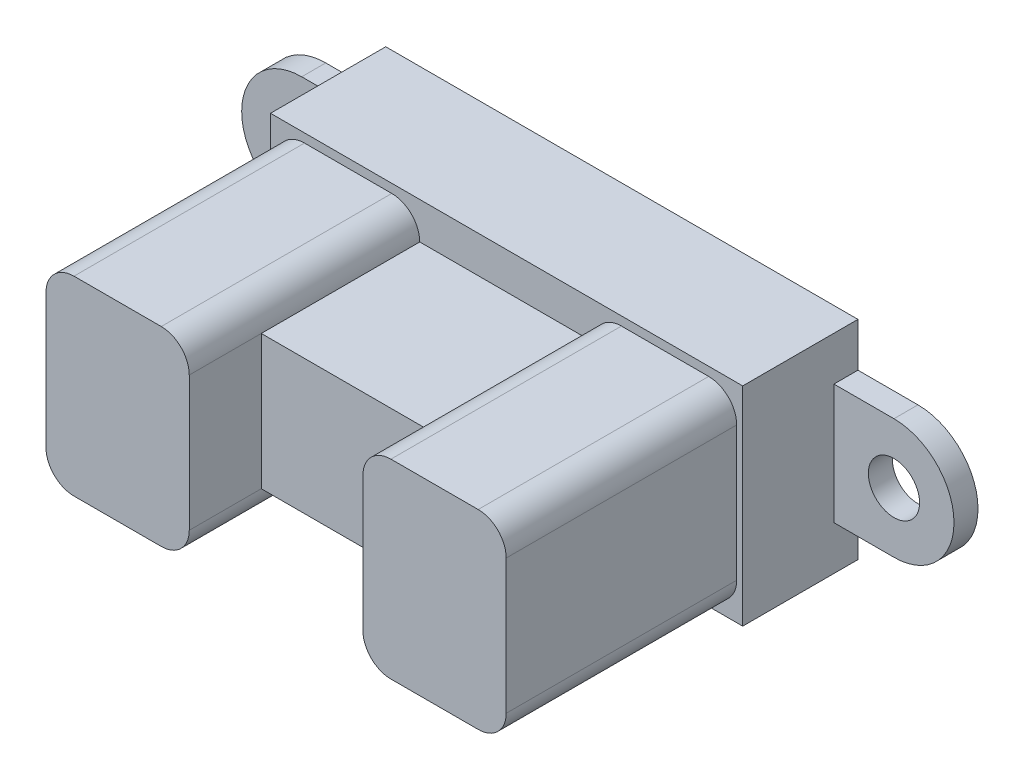
ISO-10303-21;
HEADER;
FILE_DESCRIPTION(('STEP AP214'),'2;1');
FILE_NAME('part.step','',(''),(''),'','','');
FILE_SCHEMA(('AUTOMOTIVE_DESIGN { 1 0 10303 214 1 1 1 1 }'));
ENDSEC;
DATA;
#1=APPLICATION_CONTEXT('core data for automotive mechanical design processes');
#2=APPLICATION_PROTOCOL_DEFINITION('international standard','automotive_design',2000,#1);
#3=PRODUCT_CONTEXT('',#1,'mechanical');
#4=PRODUCT('Part','Part','',(#3));
#5=PRODUCT_RELATED_PRODUCT_CATEGORY('part','',(#4));
#6=PRODUCT_DEFINITION_FORMATION('','',#4);
#7=PRODUCT_DEFINITION_CONTEXT('part definition',#1,'design');
#8=PRODUCT_DEFINITION('design','',#6,#7);
#9=PRODUCT_DEFINITION_SHAPE('','',#8);
#10=(LENGTH_UNIT() NAMED_UNIT(*) SI_UNIT(.MILLI.,.METRE.));
#11=(NAMED_UNIT(*) PLANE_ANGLE_UNIT() SI_UNIT($,.RADIAN.));
#12=(NAMED_UNIT(*) SI_UNIT($,.STERADIAN.) SOLID_ANGLE_UNIT());
#13=UNCERTAINTY_MEASURE_WITH_UNIT(LENGTH_MEASURE(1.E-05),#10,'distance_accuracy_value','');
#14=(GEOMETRIC_REPRESENTATION_CONTEXT(3) GLOBAL_UNCERTAINTY_ASSIGNED_CONTEXT((#13)) GLOBAL_UNIT_ASSIGNED_CONTEXT((#10,
#11,#12)) REPRESENTATION_CONTEXT('',''));
#15=CARTESIAN_POINT('',(0.,0.,0.));
#16=DIRECTION('',(0.,0.,1.));
#17=DIRECTION('',(1.,0.,0.));
#18=AXIS2_PLACEMENT_3D('',#15,#16,#17);
#19=CARTESIAN_POINT('',(0.,0.,7.2));
#20=DIRECTION('',(0.,0.,1.));
#21=DIRECTION('',(1.,0.,0.));
#22=AXIS2_PLACEMENT_3D('',#19,#20,#21);
#23=PLANE('',#22);
#24=DIRECTION('',(0.,1.,0.));
#25=VECTOR('',#24,1.);
#26=CARTESIAN_POINT('',(14.75,6.5,7.2));
#27=LINE('',#26,#25);
#28=CARTESIAN_POINT('',(14.75,-6.5,7.2));
#29=VERTEX_POINT('',#28);
#30=CARTESIAN_POINT('',(14.75,6.5,7.2));
#31=VERTEX_POINT('',#30);
#32=EDGE_CURVE('E396',#29,#31,#27,.T.);
#33=ORIENTED_EDGE('',*,*,#32,.T.);
#34=DIRECTION('',(-1.,0.,0.));
#35=VECTOR('',#34,1.);
#36=CARTESIAN_POINT('',(-14.75,6.5,7.2));
#37=LINE('',#36,#35);
#38=CARTESIAN_POINT('',(-14.75,6.5,7.2));
#39=VERTEX_POINT('',#38);
#40=EDGE_CURVE('E399',#31,#39,#37,.T.);
#41=ORIENTED_EDGE('',*,*,#40,.T.);
#42=DIRECTION('',(0.,-1.,0.));
#43=VECTOR('',#42,1.);
#44=CARTESIAN_POINT('',(-14.75,6.5,7.2));
#45=LINE('',#44,#43);
#46=CARTESIAN_POINT('',(-14.75,-6.5,7.2));
#47=VERTEX_POINT('',#46);
#48=EDGE_CURVE('E402',#39,#47,#45,.T.);
#49=ORIENTED_EDGE('',*,*,#48,.T.);
#50=DIRECTION('',(1.,0.,0.));
#51=VECTOR('',#50,1.);
#52=CARTESIAN_POINT('',(-14.75,-6.5,7.2));
#53=LINE('',#52,#51);
#54=EDGE_CURVE('E404',#47,#29,#53,.T.);
#55=ORIENTED_EDGE('',*,*,#54,.T.);
#56=EDGE_LOOP('',(#33,#41,#49,#55));
#57=FACE_BOUND('',#56,.T.);
#58=CARTESIAN_POINT('',(-7.175,4.2,7.2));
#59=DIRECTION('',(0.,0.,1.));
#60=DIRECTION('',(1.,0.,0.));
#61=AXIS2_PLACEMENT_3D('',#58,#59,#60);
#62=CIRCLE('',#61,1.75);
#63=CARTESIAN_POINT('',(-5.425,4.2,7.2));
#64=VERTEX_POINT('',#63);
#65=CARTESIAN_POINT('',(-7.17500000000001,5.95,7.2));
#66=VERTEX_POINT('',#65);
#67=EDGE_CURVE('E273',#64,#66,#62,.T.);
#68=ORIENTED_EDGE('',*,*,#67,.F.);
#69=DIRECTION('',(-1.,0.,0.));
#70=VECTOR('',#69,1.);
#71=CARTESIAN_POINT('',(-5.425,4.2,7.2));
#72=LINE('',#71,#70);
#73=CARTESIAN_POINT('',(5.425,4.2,7.2));
#74=VERTEX_POINT('',#73);
#75=EDGE_CURVE('E818',#74,#64,#72,.T.);
#76=ORIENTED_EDGE('',*,*,#75,.F.);
#77=CARTESIAN_POINT('',(7.175,4.2,7.2));
#78=DIRECTION('',(0.,0.,1.));
#79=DIRECTION('',(-1.,0.,0.));
#80=AXIS2_PLACEMENT_3D('',#77,#78,#79);
#81=CIRCLE('',#80,1.75);
#82=CARTESIAN_POINT('',(7.17500000000001,5.95,7.2));
#83=VERTEX_POINT('',#82);
#84=EDGE_CURVE('E264',#83,#74,#81,.T.);
#85=ORIENTED_EDGE('',*,*,#84,.F.);
#86=DIRECTION('',(-1.,0.,0.));
#87=VECTOR('',#86,1.);
#88=CARTESIAN_POINT('',(7.17500000000001,5.95,7.2));
#89=LINE('',#88,#87);
#90=CARTESIAN_POINT('',(12.625,5.95,7.2));
#91=VERTEX_POINT('',#90);
#92=EDGE_CURVE('E840',#91,#83,#89,.T.);
#93=ORIENTED_EDGE('',*,*,#92,.F.);
#94=CARTESIAN_POINT('',(12.625,4.2,7.2));
#95=DIRECTION('',(0.,0.,1.));
#96=DIRECTION('',(-1.,0.,0.));
#97=AXIS2_PLACEMENT_3D('',#94,#95,#96);
#98=CIRCLE('',#97,1.75);
#99=CARTESIAN_POINT('',(14.375,4.19999999999999,7.2));
#100=VERTEX_POINT('',#99);
#101=EDGE_CURVE('E838',#100,#91,#98,.T.);
#102=ORIENTED_EDGE('',*,*,#101,.F.);
#103=DIRECTION('',(0.,1.,0.));
#104=VECTOR('',#103,1.);
#105=CARTESIAN_POINT('',(14.375,-4.19999999999999,7.2));
#106=LINE('',#105,#104);
#107=CARTESIAN_POINT('',(14.375,-4.2,7.2));
#108=VERTEX_POINT('',#107);
#109=EDGE_CURVE('E836',#108,#100,#106,.T.);
#110=ORIENTED_EDGE('',*,*,#109,.F.);
#111=CARTESIAN_POINT('',(12.625,-4.2,7.2));
#112=DIRECTION('',(0.,0.,1.));
#113=DIRECTION('',(1.,0.,0.));
#114=AXIS2_PLACEMENT_3D('',#111,#112,#113);
#115=CIRCLE('',#114,1.75);
#116=CARTESIAN_POINT('',(12.625,-5.95,7.2));
#117=VERTEX_POINT('',#116);
#118=EDGE_CURVE('E830',#117,#108,#115,.T.);
#119=ORIENTED_EDGE('',*,*,#118,.F.);
#120=DIRECTION('',(1.,0.,0.));
#121=VECTOR('',#120,1.);
#122=CARTESIAN_POINT('',(7.17500000000001,-5.95,7.2));
#123=LINE('',#122,#121);
#124=CARTESIAN_POINT('',(7.17500000000001,-5.95,7.2));
#125=VERTEX_POINT('',#124);
#126=EDGE_CURVE('E828',#125,#117,#123,.T.);
#127=ORIENTED_EDGE('',*,*,#126,.F.);
#128=CARTESIAN_POINT('',(7.175,-4.2,7.2));
#129=DIRECTION('',(0.,0.,1.));
#130=DIRECTION('',(-1.,0.,0.));
#131=AXIS2_PLACEMENT_3D('',#128,#129,#130);
#132=CIRCLE('',#131,1.75);
#133=CARTESIAN_POINT('',(5.425,-4.19999999999999,7.2));
#134=VERTEX_POINT('',#133);
#135=EDGE_CURVE('E821',#134,#125,#132,.T.);
#136=ORIENTED_EDGE('',*,*,#135,.F.);
#137=DIRECTION('',(1.,0.,0.));
#138=VECTOR('',#137,1.);
#139=CARTESIAN_POINT('',(-5.425,-4.2,7.2));
#140=LINE('',#139,#138);
#141=CARTESIAN_POINT('',(-5.425,-4.2,7.2));
#142=VERTEX_POINT('',#141);
#143=EDGE_CURVE('E254',#142,#134,#140,.T.);
#144=ORIENTED_EDGE('',*,*,#143,.F.);
#145=CARTESIAN_POINT('',(-7.175,-4.2,7.2));
#146=DIRECTION('',(0.,0.,1.));
#147=DIRECTION('',(1.,0.,0.));
#148=AXIS2_PLACEMENT_3D('',#145,#146,#147);
#149=CIRCLE('',#148,1.75);
#150=CARTESIAN_POINT('',(-7.17500000000001,-5.95,7.2));
#151=VERTEX_POINT('',#150);
#152=EDGE_CURVE('E269',#151,#142,#149,.T.);
#153=ORIENTED_EDGE('',*,*,#152,.F.);
#154=DIRECTION('',(1.,0.,0.));
#155=VECTOR('',#154,1.);
#156=CARTESIAN_POINT('',(-7.17500000000001,-5.95,7.2));
#157=LINE('',#156,#155);
#158=CARTESIAN_POINT('',(-12.625,-5.95,7.2));
#159=VERTEX_POINT('',#158);
#160=EDGE_CURVE('E283',#159,#151,#157,.T.);
#161=ORIENTED_EDGE('',*,*,#160,.F.);
#162=CARTESIAN_POINT('',(-12.625,-4.2,7.2));
#163=DIRECTION('',(0.,0.,1.));
#164=DIRECTION('',(-1.,0.,0.));
#165=AXIS2_PLACEMENT_3D('',#162,#163,#164);
#166=CIRCLE('',#165,1.75);
#167=CARTESIAN_POINT('',(-14.375,-4.2,7.2));
#168=VERTEX_POINT('',#167);
#169=EDGE_CURVE('E305',#168,#159,#166,.T.);
#170=ORIENTED_EDGE('',*,*,#169,.F.);
#171=DIRECTION('',(0.,-1.,0.));
#172=VECTOR('',#171,1.);
#173=CARTESIAN_POINT('',(-14.375,-4.19999999999999,7.2));
#174=LINE('',#173,#172);
#175=CARTESIAN_POINT('',(-14.375,4.19999999999999,7.2));
#176=VERTEX_POINT('',#175);
#177=EDGE_CURVE('E303',#176,#168,#174,.T.);
#178=ORIENTED_EDGE('',*,*,#177,.F.);
#179=CARTESIAN_POINT('',(-12.625,4.2,7.2));
#180=DIRECTION('',(0.,0.,1.));
#181=DIRECTION('',(1.,0.,0.));
#182=AXIS2_PLACEMENT_3D('',#179,#180,#181);
#183=CIRCLE('',#182,1.75);
#184=CARTESIAN_POINT('',(-12.625,5.95,7.2));
#185=VERTEX_POINT('',#184);
#186=EDGE_CURVE('E301',#185,#176,#183,.T.);
#187=ORIENTED_EDGE('',*,*,#186,.F.);
#188=DIRECTION('',(-1.,0.,0.));
#189=VECTOR('',#188,1.);
#190=CARTESIAN_POINT('',(-7.17500000000001,5.95,7.2));
#191=LINE('',#190,#189);
#192=EDGE_CURVE('E299',#66,#185,#191,.T.);
#193=ORIENTED_EDGE('',*,*,#192,.F.);
#194=EDGE_LOOP('',(#68,#76,#85,#93,#102,#110,#119,#127,#136,#144,#153,#161,#170,#178,#187,#193));
#195=FACE_BOUND('',#194,.T.);
#196=ADVANCED_FACE('F34',(#57,#195),#23,.T.);
#197=CARTESIAN_POINT('',(-5.425,-4.19999999999999,21.6));
#198=DIRECTION('',(-1.,0.,0.));
#199=DIRECTION('',(0.,0.,1.));
#200=AXIS2_PLACEMENT_3D('',#197,#198,#199);
#201=PLANE('',#200);
#202=DIRECTION('',(0.,-1.,0.));
#203=VECTOR('',#202,1.);
#204=CARTESIAN_POINT('',(-5.425,-4.2,17.1));
#205=LINE('',#204,#203);
#206=CARTESIAN_POINT('',(-5.425,4.2,17.1));
#207=VERTEX_POINT('',#206);
#208=CARTESIAN_POINT('',(-5.425,-4.2,17.1));
#209=VERTEX_POINT('',#208);
#210=EDGE_CURVE('E242',#207,#209,#205,.T.);
#211=ORIENTED_EDGE('',*,*,#210,.F.);
#212=DIRECTION('',(0.,0.,-1.));
#213=VECTOR('',#212,1.);
#214=CARTESIAN_POINT('',(-5.425,4.19999999999999,21.6));
#215=LINE('',#214,#213);
#216=CARTESIAN_POINT('',(-5.425,4.19999999999999,21.6));
#217=VERTEX_POINT('',#216);
#218=EDGE_CURVE('E323',#217,#207,#215,.T.);
#219=ORIENTED_EDGE('',*,*,#218,.F.);
#220=DIRECTION('',(0.,1.,0.));
#221=VECTOR('',#220,1.);
#222=CARTESIAN_POINT('',(-5.425,-4.19999999999999,21.6));
#223=LINE('',#222,#221);
#224=CARTESIAN_POINT('',(-5.425,-4.19999999999999,21.6));
#225=VERTEX_POINT('',#224);
#226=EDGE_CURVE('E282',#225,#217,#223,.T.);
#227=ORIENTED_EDGE('',*,*,#226,.F.);
#228=DIRECTION('',(0.,0.,-1.));
#229=VECTOR('',#228,1.);
#230=CARTESIAN_POINT('',(-5.425,-4.19999999999999,21.6));
#231=LINE('',#230,#229);
#232=EDGE_CURVE('E326',#225,#209,#231,.T.);
#233=ORIENTED_EDGE('',*,*,#232,.T.);
#234=EDGE_LOOP('',(#211,#219,#227,#233));
#235=FACE_BOUND('',#234,.T.);
#236=ADVANCED_FACE('F474',(#235),#201,.F.);
#237=CARTESIAN_POINT('',(5.425,-4.19999999999999,21.6));
#238=DIRECTION('',(1.,0.,0.));
#239=DIRECTION('',(0.,0.,-1.));
#240=AXIS2_PLACEMENT_3D('',#237,#238,#239);
#241=PLANE('',#240);
#242=DIRECTION('',(0.,1.,0.));
#243=VECTOR('',#242,1.);
#244=CARTESIAN_POINT('',(5.425,-4.2,17.1));
#245=LINE('',#244,#243);
#246=CARTESIAN_POINT('',(5.425,-4.2,17.1));
#247=VERTEX_POINT('',#246);
#248=CARTESIAN_POINT('',(5.425,4.2,17.1));
#249=VERTEX_POINT('',#248);
#250=EDGE_CURVE('E243',#247,#249,#245,.T.);
#251=ORIENTED_EDGE('',*,*,#250,.F.);
#252=DIRECTION('',(0.,0.,-1.));
#253=VECTOR('',#252,1.);
#254=CARTESIAN_POINT('',(5.425,-4.19999999999999,21.6));
#255=LINE('',#254,#253);
#256=CARTESIAN_POINT('',(5.425,-4.19999999999999,21.6));
#257=VERTEX_POINT('',#256);
#258=EDGE_CURVE('E270',#257,#247,#255,.T.);
#259=ORIENTED_EDGE('',*,*,#258,.F.);
#260=DIRECTION('',(0.,-1.,0.));
#261=VECTOR('',#260,1.);
#262=CARTESIAN_POINT('',(5.425,-4.19999999999999,21.6));
#263=LINE('',#262,#261);
#264=CARTESIAN_POINT('',(5.425,4.19999999999999,21.6));
#265=VERTEX_POINT('',#264);
#266=EDGE_CURVE('E267',#265,#257,#263,.T.);
#267=ORIENTED_EDGE('',*,*,#266,.F.);
#268=DIRECTION('',(0.,0.,-1.));
#269=VECTOR('',#268,1.);
#270=CARTESIAN_POINT('',(5.425,4.19999999999999,21.6));
#271=LINE('',#270,#269);
#272=EDGE_CURVE('E261',#265,#249,#271,.T.);
#273=ORIENTED_EDGE('',*,*,#272,.T.);
#274=EDGE_LOOP('',(#251,#259,#267,#273));
#275=FACE_BOUND('',#274,.T.);
#276=ADVANCED_FACE('F266',(#275),#241,.F.);
#277=CARTESIAN_POINT('',(14.75,6.5,7.2));
#278=DIRECTION('',(-1.,0.,0.));
#279=DIRECTION('',(0.,-1.,0.));
#280=AXIS2_PLACEMENT_3D('',#277,#278,#279);
#281=PLANE('',#280);
#282=DIRECTION('',(0.,0.,-1.));
#283=VECTOR('',#282,1.);
#284=CARTESIAN_POINT('',(14.75,-3.75,1.5));
#285=LINE('',#284,#283);
#286=CARTESIAN_POINT('',(14.75,-3.75,1.5));
#287=VERTEX_POINT('',#286);
#288=CARTESIAN_POINT('',(14.75,-3.75,0.));
#289=VERTEX_POINT('',#288);
#290=EDGE_CURVE('E354',#287,#289,#285,.T.);
#291=ORIENTED_EDGE('',*,*,#290,.F.);
#292=DIRECTION('',(0.,-1.,0.));
#293=VECTOR('',#292,1.);
#294=CARTESIAN_POINT('',(14.75,-3.75,1.5));
#295=LINE('',#294,#293);
#296=CARTESIAN_POINT('',(14.75,3.75,1.5));
#297=VERTEX_POINT('',#296);
#298=EDGE_CURVE('E342',#297,#287,#295,.T.);
#299=ORIENTED_EDGE('',*,*,#298,.F.);
#300=DIRECTION('',(0.,0.,-1.));
#301=VECTOR('',#300,1.);
#302=CARTESIAN_POINT('',(14.75,3.75,1.5));
#303=LINE('',#302,#301);
#304=CARTESIAN_POINT('',(14.75,3.75,0.));
#305=VERTEX_POINT('',#304);
#306=EDGE_CURVE('E356',#297,#305,#303,.T.);
#307=ORIENTED_EDGE('',*,*,#306,.T.);
#308=DIRECTION('',(0.,1.,0.));
#309=VECTOR('',#308,1.);
#310=CARTESIAN_POINT('',(14.75,6.5,0.));
#311=LINE('',#310,#309);
#312=CARTESIAN_POINT('',(14.75,6.5,0.));
#313=VERTEX_POINT('',#312);
#314=EDGE_CURVE('E395',#305,#313,#311,.T.);
#315=ORIENTED_EDGE('',*,*,#314,.T.);
#316=DIRECTION('',(0.,0.,-1.));
#317=VECTOR('',#316,1.);
#318=CARTESIAN_POINT('',(14.75,6.5,7.2));
#319=LINE('',#318,#317);
#320=EDGE_CURVE('E11',#31,#313,#319,.T.);
#321=ORIENTED_EDGE('',*,*,#320,.F.);
#322=ORIENTED_EDGE('',*,*,#32,.F.);
#323=DIRECTION('',(0.,0.,-1.));
#324=VECTOR('',#323,1.);
#325=CARTESIAN_POINT('',(14.75,-6.5,7.2));
#326=LINE('',#325,#324);
#327=CARTESIAN_POINT('',(14.75,-6.5,0.));
#328=VERTEX_POINT('',#327);
#329=EDGE_CURVE('E406',#29,#328,#326,.T.);
#330=ORIENTED_EDGE('',*,*,#329,.T.);
#331=EDGE_CURVE('E407',#328,#289,#311,.T.);
#332=ORIENTED_EDGE('',*,*,#331,.T.);
#333=EDGE_LOOP('',(#291,#299,#307,#315,#321,#322,#330,#332));
#334=FACE_BOUND('',#333,.T.);
#335=ADVANCED_FACE('F36',(#334),#281,.F.);
#336=CARTESIAN_POINT('',(-14.75,6.5,7.2));
#337=DIRECTION('',(1.,0.,0.));
#338=DIRECTION('',(0.,1.,0.));
#339=AXIS2_PLACEMENT_3D('',#336,#337,#338);
#340=PLANE('',#339);
#341=DIRECTION('',(0.,0.,-1.));
#342=VECTOR('',#341,1.);
#343=CARTESIAN_POINT('',(-14.75,3.75,1.5));
#344=LINE('',#343,#342);
#345=CARTESIAN_POINT('',(-14.75,3.75,1.5));
#346=VERTEX_POINT('',#345);
#347=CARTESIAN_POINT('',(-14.75,3.75,0.));
#348=VERTEX_POINT('',#347);
#349=EDGE_CURVE('E387',#346,#348,#344,.T.);
#350=ORIENTED_EDGE('',*,*,#349,.F.);
#351=DIRECTION('',(0.,1.,0.));
#352=VECTOR('',#351,1.);
#353=CARTESIAN_POINT('',(-14.75,-3.75,1.5));
#354=LINE('',#353,#352);
#355=CARTESIAN_POINT('',(-14.75,-3.75,1.5));
#356=VERTEX_POINT('',#355);
#357=EDGE_CURVE('E375',#356,#346,#354,.T.);
#358=ORIENTED_EDGE('',*,*,#357,.F.);
#359=DIRECTION('',(0.,0.,-1.));
#360=VECTOR('',#359,1.);
#361=CARTESIAN_POINT('',(-14.75,-3.75,1.5));
#362=LINE('',#361,#360);
#363=CARTESIAN_POINT('',(-14.75,-3.75,0.));
#364=VERTEX_POINT('',#363);
#365=EDGE_CURVE('E389',#356,#364,#362,.T.);
#366=ORIENTED_EDGE('',*,*,#365,.T.);
#367=DIRECTION('',(0.,-1.,0.));
#368=VECTOR('',#367,1.);
#369=CARTESIAN_POINT('',(-14.75,6.5,0.));
#370=LINE('',#369,#368);
#371=CARTESIAN_POINT('',(-14.75,-6.5,0.));
#372=VERTEX_POINT('',#371);
#373=EDGE_CURVE('E412',#364,#372,#370,.T.);
#374=ORIENTED_EDGE('',*,*,#373,.T.);
#375=DIRECTION('',(0.,0.,-1.));
#376=VECTOR('',#375,1.);
#377=CARTESIAN_POINT('',(-14.75,-6.5,7.2));
#378=LINE('',#377,#376);
#379=EDGE_CURVE('E419',#47,#372,#378,.T.);
#380=ORIENTED_EDGE('',*,*,#379,.F.);
#381=ORIENTED_EDGE('',*,*,#48,.F.);
#382=DIRECTION('',(0.,0.,-1.));
#383=VECTOR('',#382,1.);
#384=CARTESIAN_POINT('',(-14.75,6.5,7.2));
#385=LINE('',#384,#383);
#386=CARTESIAN_POINT('',(-14.75,6.5,0.));
#387=VERTEX_POINT('',#386);
#388=EDGE_CURVE('E42',#39,#387,#385,.T.);
#389=ORIENTED_EDGE('',*,*,#388,.T.);
#390=EDGE_CURVE('E413',#387,#348,#370,.T.);
#391=ORIENTED_EDGE('',*,*,#390,.T.);
#392=EDGE_LOOP('',(#350,#358,#366,#374,#380,#381,#389,#391));
#393=FACE_BOUND('',#392,.T.);
#394=ADVANCED_FACE('F427',(#393),#340,.F.);
#395=CARTESIAN_POINT('',(-14.75,6.5,7.2));
#396=DIRECTION('',(0.,-1.,0.));
#397=DIRECTION('',(0.,0.,-1.));
#398=AXIS2_PLACEMENT_3D('',#395,#396,#397);
#399=PLANE('',#398);
#400=DIRECTION('',(-1.,0.,0.));
#401=VECTOR('',#400,1.);
#402=CARTESIAN_POINT('',(-14.75,6.5,0.));
#403=LINE('',#402,#401);
#404=EDGE_CURVE('E410',#313,#387,#403,.T.);
#405=ORIENTED_EDGE('',*,*,#404,.T.);
#406=ORIENTED_EDGE('',*,*,#388,.F.);
#407=ORIENTED_EDGE('',*,*,#40,.F.);
#408=ORIENTED_EDGE('',*,*,#320,.T.);
#409=EDGE_LOOP('',(#405,#406,#407,#408));
#410=FACE_BOUND('',#409,.T.);
#411=ADVANCED_FACE('F465',(#410),#399,.F.);
#412=CARTESIAN_POINT('',(-14.75,-6.5,7.2));
#413=DIRECTION('',(0.,1.,0.));
#414=DIRECTION('',(0.,0.,1.));
#415=AXIS2_PLACEMENT_3D('',#412,#413,#414);
#416=PLANE('',#415);
#417=DIRECTION('',(1.,0.,0.));
#418=VECTOR('',#417,1.);
#419=CARTESIAN_POINT('',(-14.75,-6.5,0.));
#420=LINE('',#419,#418);
#421=EDGE_CURVE('E400',#372,#328,#420,.T.);
#422=ORIENTED_EDGE('',*,*,#421,.T.);
#423=ORIENTED_EDGE('',*,*,#329,.F.);
#424=ORIENTED_EDGE('',*,*,#54,.F.);
#425=ORIENTED_EDGE('',*,*,#379,.T.);
#426=EDGE_LOOP('',(#422,#423,#424,#425));
#427=FACE_BOUND('',#426,.T.);
#428=ADVANCED_FACE('F457',(#427),#416,.F.);
#429=CARTESIAN_POINT('',(0.,0.,0.));
#430=DIRECTION('',(0.,0.,1.));
#431=DIRECTION('',(1.,0.,0.));
#432=AXIS2_PLACEMENT_3D('',#429,#430,#431);
#433=PLANE('',#432);
#434=ORIENTED_EDGE('',*,*,#331,.F.);
#435=ORIENTED_EDGE('',*,*,#421,.F.);
#436=ORIENTED_EDGE('',*,*,#373,.F.);
#437=DIRECTION('',(1.,0.,0.));
#438=VECTOR('',#437,1.);
#439=CARTESIAN_POINT('',(-18.5,-3.75,0.));
#440=LINE('',#439,#438);
#441=CARTESIAN_POINT('',(-18.5,-3.75,0.));
#442=VERTEX_POINT('',#441);
#443=EDGE_CURVE('E382',#442,#364,#440,.T.);
#444=ORIENTED_EDGE('',*,*,#443,.F.);
#445=CARTESIAN_POINT('',(-18.5,0.,0.));
#446=DIRECTION('',(0.,0.,1.));
#447=DIRECTION('',(1.,0.,0.));
#448=AXIS2_PLACEMENT_3D('',#445,#446,#447);
#449=CIRCLE('',#448,3.75);
#450=CARTESIAN_POINT('',(-18.5,3.75,0.));
#451=VERTEX_POINT('',#450);
#452=EDGE_CURVE('E366',#451,#442,#449,.T.);
#453=ORIENTED_EDGE('',*,*,#452,.F.);
#454=DIRECTION('',(-1.,0.,0.));
#455=VECTOR('',#454,1.);
#456=CARTESIAN_POINT('',(-18.5,3.75,0.));
#457=LINE('',#456,#455);
#458=EDGE_CURVE('E373',#348,#451,#457,.T.);
#459=ORIENTED_EDGE('',*,*,#458,.F.);
#460=ORIENTED_EDGE('',*,*,#390,.F.);
#461=ORIENTED_EDGE('',*,*,#404,.F.);
#462=ORIENTED_EDGE('',*,*,#314,.F.);
#463=DIRECTION('',(-1.,0.,0.));
#464=VECTOR('',#463,1.);
#465=CARTESIAN_POINT('',(18.5,3.75,0.));
#466=LINE('',#465,#464);
#467=CARTESIAN_POINT('',(18.5,3.75,0.));
#468=VERTEX_POINT('',#467);
#469=EDGE_CURVE('E349',#468,#305,#466,.T.);
#470=ORIENTED_EDGE('',*,*,#469,.F.);
#471=CARTESIAN_POINT('',(18.5,0.,0.));
#472=DIRECTION('',(0.,0.,1.));
#473=DIRECTION('',(-1.,0.,0.));
#474=AXIS2_PLACEMENT_3D('',#471,#472,#473);
#475=CIRCLE('',#474,3.75);
#476=CARTESIAN_POINT('',(18.5,-3.75,0.));
#477=VERTEX_POINT('',#476);
#478=EDGE_CURVE('E333',#477,#468,#475,.T.);
#479=ORIENTED_EDGE('',*,*,#478,.F.);
#480=DIRECTION('',(1.,0.,0.));
#481=VECTOR('',#480,1.);
#482=CARTESIAN_POINT('',(18.5,-3.75,0.));
#483=LINE('',#482,#481);
#484=EDGE_CURVE('E340',#289,#477,#483,.T.);
#485=ORIENTED_EDGE('',*,*,#484,.F.);
#486=EDGE_LOOP('',(#434,#435,#436,#444,#453,#459,#460,#461,#462,#470,#479,#485));
#487=FACE_BOUND('',#486,.T.);
#488=CARTESIAN_POINT('',(-18.5,0.,0.));
#489=DIRECTION('',(0.,0.,1.));
#490=DIRECTION('',(1.,0.,0.));
#491=AXIS2_PLACEMENT_3D('',#488,#489,#490);
#492=CIRCLE('',#491,1.6);
#493=CARTESIAN_POINT('',(-16.9,0.,0.));
#494=VERTEX_POINT('',#493);
#495=EDGE_CURVE('E362',#494,#494,#492,.T.);
#496=ORIENTED_EDGE('',*,*,#495,.T.);
#497=EDGE_LOOP('',(#496));
#498=FACE_BOUND('',#497,.T.);
#499=CARTESIAN_POINT('',(18.5,0.,0.));
#500=DIRECTION('',(0.,0.,1.));
#501=DIRECTION('',(-1.,0.,0.));
#502=AXIS2_PLACEMENT_3D('',#499,#500,#501);
#503=CIRCLE('',#502,1.6);
#504=CARTESIAN_POINT('',(16.9,0.,0.));
#505=VERTEX_POINT('',#504);
#506=EDGE_CURVE('E329',#505,#505,#503,.T.);
#507=ORIENTED_EDGE('',*,*,#506,.T.);
#508=EDGE_LOOP('',(#507));
#509=FACE_BOUND('',#508,.T.);
#510=ADVANCED_FACE('F434',(#487,#498,#509),#433,.F.);
#511=CARTESIAN_POINT('',(-18.5,0.,1.5));
#512=DIRECTION('',(0.,0.,1.));
#513=DIRECTION('',(1.,0.,0.));
#514=AXIS2_PLACEMENT_3D('',#511,#512,#513);
#515=PLANE('',#514);
#516=CARTESIAN_POINT('',(-18.5,0.,1.5));
#517=DIRECTION('',(0.,0.,1.));
#518=DIRECTION('',(1.,0.,0.));
#519=AXIS2_PLACEMENT_3D('',#516,#517,#518);
#520=CIRCLE('',#519,3.75);
#521=CARTESIAN_POINT('',(-18.5,3.75,1.5));
#522=VERTEX_POINT('',#521);
#523=CARTESIAN_POINT('',(-18.5,-3.75,1.5));
#524=VERTEX_POINT('',#523);
#525=EDGE_CURVE('E369',#522,#524,#520,.T.);
#526=ORIENTED_EDGE('',*,*,#525,.T.);
#527=DIRECTION('',(1.,0.,0.));
#528=VECTOR('',#527,1.);
#529=CARTESIAN_POINT('',(-18.5,-3.75,1.5));
#530=LINE('',#529,#528);
#531=EDGE_CURVE('E372',#524,#356,#530,.T.);
#532=ORIENTED_EDGE('',*,*,#531,.T.);
#533=ORIENTED_EDGE('',*,*,#357,.T.);
#534=DIRECTION('',(-1.,0.,0.));
#535=VECTOR('',#534,1.);
#536=CARTESIAN_POINT('',(-18.5,3.75,1.5));
#537=LINE('',#536,#535);
#538=EDGE_CURVE('E377',#346,#522,#537,.T.);
#539=ORIENTED_EDGE('',*,*,#538,.T.);
#540=EDGE_LOOP('',(#526,#532,#533,#539));
#541=FACE_BOUND('',#540,.T.);
#542=CARTESIAN_POINT('',(-18.5,0.,1.5));
#543=DIRECTION('',(0.,0.,1.));
#544=DIRECTION('',(1.,0.,0.));
#545=AXIS2_PLACEMENT_3D('',#542,#543,#544);
#546=CIRCLE('',#545,1.6);
#547=CARTESIAN_POINT('',(-16.9,0.,1.5));
#548=VERTEX_POINT('',#547);
#549=EDGE_CURVE('E363',#548,#548,#546,.T.);
#550=ORIENTED_EDGE('',*,*,#549,.F.);
#551=EDGE_LOOP('',(#550));
#552=FACE_BOUND('',#551,.T.);
#553=ADVANCED_FACE('F447',(#541,#552),#515,.T.);
#554=CARTESIAN_POINT('',(-18.5,0.,1.5));
#555=DIRECTION('',(0.,0.,-1.));
#556=DIRECTION('',(-1.,0.,0.));
#557=AXIS2_PLACEMENT_3D('',#554,#555,#556);
#558=CYLINDRICAL_SURFACE('',#557,3.75);
#559=ORIENTED_EDGE('',*,*,#452,.T.);
#560=DIRECTION('',(0.,0.,-1.));
#561=VECTOR('',#560,1.);
#562=CARTESIAN_POINT('',(-18.5,-3.75,1.5));
#563=LINE('',#562,#561);
#564=EDGE_CURVE('E392',#524,#442,#563,.T.);
#565=ORIENTED_EDGE('',*,*,#564,.F.);
#566=ORIENTED_EDGE('',*,*,#525,.F.);
#567=DIRECTION('',(0.,0.,-1.));
#568=VECTOR('',#567,1.);
#569=CARTESIAN_POINT('',(-18.5,3.75,1.5));
#570=LINE('',#569,#568);
#571=EDGE_CURVE('E379',#522,#451,#570,.T.);
#572=ORIENTED_EDGE('',*,*,#571,.T.);
#573=EDGE_LOOP('',(#559,#565,#566,#572));
#574=FACE_BOUND('',#573,.T.);
#575=ADVANCED_FACE('F444',(#574),#558,.T.);
#576=CARTESIAN_POINT('',(-18.5,-3.75,1.5));
#577=DIRECTION('',(0.,1.,0.));
#578=DIRECTION('',(0.,0.,1.));
#579=AXIS2_PLACEMENT_3D('',#576,#577,#578);
#580=PLANE('',#579);
#581=ORIENTED_EDGE('',*,*,#443,.T.);
#582=ORIENTED_EDGE('',*,*,#365,.F.);
#583=ORIENTED_EDGE('',*,*,#531,.F.);
#584=ORIENTED_EDGE('',*,*,#564,.T.);
#585=EDGE_LOOP('',(#581,#582,#583,#584));
#586=FACE_BOUND('',#585,.T.);
#587=ADVANCED_FACE('F492',(#586),#580,.F.);
#588=CARTESIAN_POINT('',(-18.5,3.75,1.5));
#589=DIRECTION('',(0.,-1.,0.));
#590=DIRECTION('',(0.,0.,-1.));
#591=AXIS2_PLACEMENT_3D('',#588,#589,#590);
#592=PLANE('',#591);
#593=ORIENTED_EDGE('',*,*,#458,.T.);
#594=ORIENTED_EDGE('',*,*,#571,.F.);
#595=ORIENTED_EDGE('',*,*,#538,.F.);
#596=ORIENTED_EDGE('',*,*,#349,.T.);
#597=EDGE_LOOP('',(#593,#594,#595,#596));
#598=FACE_BOUND('',#597,.T.);
#599=ADVANCED_FACE('F440',(#598),#592,.F.);
#600=CARTESIAN_POINT('',(-18.5,0.,1.5));
#601=DIRECTION('',(0.,0.,-1.));
#602=DIRECTION('',(-1.,0.,0.));
#603=AXIS2_PLACEMENT_3D('',#600,#601,#602);
#604=CYLINDRICAL_SURFACE('',#603,1.6);
#605=ORIENTED_EDGE('',*,*,#549,.T.);
#606=EDGE_LOOP('',(#605));
#607=FACE_BOUND('',#606,.T.);
#608=ORIENTED_EDGE('',*,*,#495,.F.);
#609=EDGE_LOOP('',(#608));
#610=FACE_BOUND('',#609,.T.);
#611=ADVANCED_FACE('F495',(#607,#610),#604,.F.);
#612=CARTESIAN_POINT('',(18.5,0.,1.5));
#613=DIRECTION('',(0.,0.,-1.));
#614=DIRECTION('',(-1.,0.,0.));
#615=AXIS2_PLACEMENT_3D('',#612,#613,#614);
#616=PLANE('',#615);
#617=CARTESIAN_POINT('',(18.5,0.,1.5));
#618=DIRECTION('',(0.,0.,1.));
#619=DIRECTION('',(-1.,0.,0.));
#620=AXIS2_PLACEMENT_3D('',#617,#618,#619);
#621=CIRCLE('',#620,3.75);
#622=CARTESIAN_POINT('',(18.5,-3.75,1.5));
#623=VERTEX_POINT('',#622);
#624=CARTESIAN_POINT('',(18.5,3.75,1.5));
#625=VERTEX_POINT('',#624);
#626=EDGE_CURVE('E336',#623,#625,#621,.T.);
#627=ORIENTED_EDGE('',*,*,#626,.T.);
#628=DIRECTION('',(-1.,0.,0.));
#629=VECTOR('',#628,1.);
#630=CARTESIAN_POINT('',(18.5,3.75,1.5));
#631=LINE('',#630,#629);
#632=EDGE_CURVE('E339',#625,#297,#631,.T.);
#633=ORIENTED_EDGE('',*,*,#632,.T.);
#634=ORIENTED_EDGE('',*,*,#298,.T.);
#635=DIRECTION('',(1.,0.,0.));
#636=VECTOR('',#635,1.);
#637=CARTESIAN_POINT('',(18.5,-3.75,1.5));
#638=LINE('',#637,#636);
#639=EDGE_CURVE('E344',#287,#623,#638,.T.);
#640=ORIENTED_EDGE('',*,*,#639,.T.);
#641=EDGE_LOOP('',(#627,#633,#634,#640));
#642=FACE_BOUND('',#641,.T.);
#643=CARTESIAN_POINT('',(18.5,0.,1.5));
#644=DIRECTION('',(0.,0.,1.));
#645=DIRECTION('',(-1.,0.,0.));
#646=AXIS2_PLACEMENT_3D('',#643,#644,#645);
#647=CIRCLE('',#646,1.6);
#648=CARTESIAN_POINT('',(16.9,0.,1.5));
#649=VERTEX_POINT('',#648);
#650=EDGE_CURVE('E330',#649,#649,#647,.T.);
#651=ORIENTED_EDGE('',*,*,#650,.F.);
#652=EDGE_LOOP('',(#651));
#653=FACE_BOUND('',#652,.T.);
#654=ADVANCED_FACE('F513',(#642,#653),#616,.F.);
#655=CARTESIAN_POINT('',(18.5,0.,1.5));
#656=DIRECTION('',(0.,0.,-1.));
#657=DIRECTION('',(-1.,0.,0.));
#658=AXIS2_PLACEMENT_3D('',#655,#656,#657);
#659=CYLINDRICAL_SURFACE('',#658,3.75);
#660=ORIENTED_EDGE('',*,*,#478,.T.);
#661=DIRECTION('',(0.,0.,-1.));
#662=VECTOR('',#661,1.);
#663=CARTESIAN_POINT('',(18.5,3.75,1.5));
#664=LINE('',#663,#662);
#665=EDGE_CURVE('E359',#625,#468,#664,.T.);
#666=ORIENTED_EDGE('',*,*,#665,.F.);
#667=ORIENTED_EDGE('',*,*,#626,.F.);
#668=DIRECTION('',(0.,0.,-1.));
#669=VECTOR('',#668,1.);
#670=CARTESIAN_POINT('',(18.5,-3.75,1.5));
#671=LINE('',#670,#669);
#672=EDGE_CURVE('E346',#623,#477,#671,.T.);
#673=ORIENTED_EDGE('',*,*,#672,.T.);
#674=EDGE_LOOP('',(#660,#666,#667,#673));
#675=FACE_BOUND('',#674,.T.);
#676=ADVANCED_FACE('F520',(#675),#659,.T.);
#677=CARTESIAN_POINT('',(18.5,3.75,1.5));
#678=DIRECTION('',(0.,-1.,0.));
#679=DIRECTION('',(0.,0.,-1.));
#680=AXIS2_PLACEMENT_3D('',#677,#678,#679);
#681=PLANE('',#680);
#682=ORIENTED_EDGE('',*,*,#469,.T.);
#683=ORIENTED_EDGE('',*,*,#306,.F.);
#684=ORIENTED_EDGE('',*,*,#632,.F.);
#685=ORIENTED_EDGE('',*,*,#665,.T.);
#686=EDGE_LOOP('',(#682,#683,#684,#685));
#687=FACE_BOUND('',#686,.T.);
#688=ADVANCED_FACE('F528',(#687),#681,.F.);
#689=CARTESIAN_POINT('',(18.5,-3.75,1.5));
#690=DIRECTION('',(0.,1.,0.));
#691=DIRECTION('',(0.,0.,1.));
#692=AXIS2_PLACEMENT_3D('',#689,#690,#691);
#693=PLANE('',#692);
#694=ORIENTED_EDGE('',*,*,#484,.T.);
#695=ORIENTED_EDGE('',*,*,#672,.F.);
#696=ORIENTED_EDGE('',*,*,#639,.F.);
#697=ORIENTED_EDGE('',*,*,#290,.T.);
#698=EDGE_LOOP('',(#694,#695,#696,#697));
#699=FACE_BOUND('',#698,.T.);
#700=ADVANCED_FACE('F535',(#699),#693,.F.);
#701=CARTESIAN_POINT('',(18.5,0.,1.5));
#702=DIRECTION('',(0.,0.,-1.));
#703=DIRECTION('',(-1.,0.,0.));
#704=AXIS2_PLACEMENT_3D('',#701,#702,#703);
#705=CYLINDRICAL_SURFACE('',#704,1.6);
#706=ORIENTED_EDGE('',*,*,#650,.T.);
#707=EDGE_LOOP('',(#706));
#708=FACE_BOUND('',#707,.T.);
#709=ORIENTED_EDGE('',*,*,#506,.F.);
#710=EDGE_LOOP('',(#709));
#711=FACE_BOUND('',#710,.T.);
#712=ADVANCED_FACE('F543',(#708,#711),#705,.F.);
#713=CARTESIAN_POINT('',(-7.175,-4.2,21.6));
#714=DIRECTION('',(0.,0.,-1.));
#715=DIRECTION('',(-1.,0.,0.));
#716=AXIS2_PLACEMENT_3D('',#713,#714,#715);
#717=CYLINDRICAL_SURFACE('',#716,1.75);
#718=ORIENTED_EDGE('',*,*,#152,.T.);
#719=DIRECTION('',(0.,0.,-1.));
#720=VECTOR('',#719,1.);
#721=CARTESIAN_POINT('',(-5.425,-4.2,17.1));
#722=LINE('',#721,#720);
#723=EDGE_CURVE('E815',#209,#142,#722,.T.);
#724=ORIENTED_EDGE('',*,*,#723,.F.);
#725=ORIENTED_EDGE('',*,*,#232,.F.);
#726=CARTESIAN_POINT('',(-7.175,-4.2,21.6));
#727=DIRECTION('',(0.,0.,1.));
#728=DIRECTION('',(1.,0.,0.));
#729=AXIS2_PLACEMENT_3D('',#726,#727,#728);
#730=CIRCLE('',#729,1.75);
#731=CARTESIAN_POINT('',(-7.17500000000001,-5.95,21.6));
#732=VERTEX_POINT('',#731);
#733=EDGE_CURVE('E279',#732,#225,#730,.T.);
#734=ORIENTED_EDGE('',*,*,#733,.F.);
#735=DIRECTION('',(0.,0.,-1.));
#736=VECTOR('',#735,1.);
#737=CARTESIAN_POINT('',(-7.17500000000001,-5.95,21.6));
#738=LINE('',#737,#736);
#739=EDGE_CURVE('E296',#732,#151,#738,.T.);
#740=ORIENTED_EDGE('',*,*,#739,.T.);
#741=EDGE_LOOP('',(#718,#724,#725,#734,#740));
#742=FACE_BOUND('',#741,.T.);
#743=ADVANCED_FACE('F551',(#742),#717,.T.);
#744=CARTESIAN_POINT('',(-7.175,4.2,21.6));
#745=DIRECTION('',(0.,0.,-1.));
#746=DIRECTION('',(-1.,0.,0.));
#747=AXIS2_PLACEMENT_3D('',#744,#745,#746);
#748=CYLINDRICAL_SURFACE('',#747,1.75);
#749=ORIENTED_EDGE('',*,*,#67,.T.);
#750=DIRECTION('',(0.,0.,-1.));
#751=VECTOR('',#750,1.);
#752=CARTESIAN_POINT('',(-7.17500000000001,5.95,21.6));
#753=LINE('',#752,#751);
#754=CARTESIAN_POINT('',(-7.17500000000001,5.95,21.6));
#755=VERTEX_POINT('',#754);
#756=EDGE_CURVE('E320',#755,#66,#753,.T.);
#757=ORIENTED_EDGE('',*,*,#756,.F.);
#758=CARTESIAN_POINT('',(-7.175,4.2,21.6));
#759=DIRECTION('',(0.,0.,1.));
#760=DIRECTION('',(1.,0.,0.));
#761=AXIS2_PLACEMENT_3D('',#758,#759,#760);
#762=CIRCLE('',#761,1.75);
#763=EDGE_CURVE('E285',#217,#755,#762,.T.);
#764=ORIENTED_EDGE('',*,*,#763,.F.);
#765=ORIENTED_EDGE('',*,*,#218,.T.);
#766=DIRECTION('',(0.,0.,-1.));
#767=VECTOR('',#766,1.);
#768=CARTESIAN_POINT('',(-5.425,4.2,17.1));
#769=LINE('',#768,#767);
#770=EDGE_CURVE('E239',#207,#64,#769,.T.);
#771=ORIENTED_EDGE('',*,*,#770,.T.);
#772=EDGE_LOOP('',(#749,#757,#764,#765,#771));
#773=FACE_BOUND('',#772,.T.);
#774=ADVANCED_FACE('F560',(#773),#748,.T.);
#775=CARTESIAN_POINT('',(-7.17500000000001,5.95,21.6));
#776=DIRECTION('',(0.,-1.,0.));
#777=DIRECTION('',(1.,0.,0.));
#778=AXIS2_PLACEMENT_3D('',#775,#776,#777);
#779=PLANE('',#778);
#780=ORIENTED_EDGE('',*,*,#192,.T.);
#781=DIRECTION('',(0.,0.,-1.));
#782=VECTOR('',#781,1.);
#783=CARTESIAN_POINT('',(-12.625,5.95,21.6));
#784=LINE('',#783,#782);
#785=CARTESIAN_POINT('',(-12.625,5.95,21.6));
#786=VERTEX_POINT('',#785);
#787=EDGE_CURVE('E317',#786,#185,#784,.T.);
#788=ORIENTED_EDGE('',*,*,#787,.F.);
#789=DIRECTION('',(-1.,0.,0.));
#790=VECTOR('',#789,1.);
#791=CARTESIAN_POINT('',(-7.17500000000001,5.95,21.6));
#792=LINE('',#791,#790);
#793=EDGE_CURVE('E287',#755,#786,#792,.T.);
#794=ORIENTED_EDGE('',*,*,#793,.F.);
#795=ORIENTED_EDGE('',*,*,#756,.T.);
#796=EDGE_LOOP('',(#780,#788,#794,#795));
#797=FACE_BOUND('',#796,.T.);
#798=ADVANCED_FACE('F569',(#797),#779,.F.);
#799=CARTESIAN_POINT('',(-12.625,4.2,21.6));
#800=DIRECTION('',(0.,0.,-1.));
#801=DIRECTION('',(-1.,0.,0.));
#802=AXIS2_PLACEMENT_3D('',#799,#800,#801);
#803=CYLINDRICAL_SURFACE('',#802,1.75);
#804=ORIENTED_EDGE('',*,*,#186,.T.);
#805=DIRECTION('',(0.,0.,-1.));
#806=VECTOR('',#805,1.);
#807=CARTESIAN_POINT('',(-14.375,4.19999999999999,21.6));
#808=LINE('',#807,#806);
#809=CARTESIAN_POINT('',(-14.375,4.19999999999999,21.6));
#810=VERTEX_POINT('',#809);
#811=EDGE_CURVE('E314',#810,#176,#808,.T.);
#812=ORIENTED_EDGE('',*,*,#811,.F.);
#813=CARTESIAN_POINT('',(-12.625,4.2,21.6));
#814=DIRECTION('',(0.,0.,1.));
#815=DIRECTION('',(1.,0.,0.));
#816=AXIS2_PLACEMENT_3D('',#813,#814,#815);
#817=CIRCLE('',#816,1.75);
#818=EDGE_CURVE('E289',#786,#810,#817,.T.);
#819=ORIENTED_EDGE('',*,*,#818,.F.);
#820=ORIENTED_EDGE('',*,*,#787,.T.);
#821=EDGE_LOOP('',(#804,#812,#819,#820));
#822=FACE_BOUND('',#821,.T.);
#823=ADVANCED_FACE('F577',(#822),#803,.T.);
#824=CARTESIAN_POINT('',(-14.375,-4.19999999999999,21.6));
#825=DIRECTION('',(1.,0.,0.));
#826=DIRECTION('',(0.,1.,0.));
#827=AXIS2_PLACEMENT_3D('',#824,#825,#826);
#828=PLANE('',#827);
#829=ORIENTED_EDGE('',*,*,#177,.T.);
#830=DIRECTION('',(0.,0.,-1.));
#831=VECTOR('',#830,1.);
#832=CARTESIAN_POINT('',(-14.375,-4.2,21.6));
#833=LINE('',#832,#831);
#834=CARTESIAN_POINT('',(-14.375,-4.2,21.6));
#835=VERTEX_POINT('',#834);
#836=EDGE_CURVE('E311',#835,#168,#833,.T.);
#837=ORIENTED_EDGE('',*,*,#836,.F.);
#838=DIRECTION('',(0.,-1.,0.));
#839=VECTOR('',#838,1.);
#840=CARTESIAN_POINT('',(-14.375,-4.19999999999999,21.6));
#841=LINE('',#840,#839);
#842=EDGE_CURVE('E291',#810,#835,#841,.T.);
#843=ORIENTED_EDGE('',*,*,#842,.F.);
#844=ORIENTED_EDGE('',*,*,#811,.T.);
#845=EDGE_LOOP('',(#829,#837,#843,#844));
#846=FACE_BOUND('',#845,.T.);
#847=ADVANCED_FACE('F585',(#846),#828,.F.);
#848=CARTESIAN_POINT('',(-12.625,-4.2,21.6));
#849=DIRECTION('',(0.,0.,-1.));
#850=DIRECTION('',(-1.,0.,0.));
#851=AXIS2_PLACEMENT_3D('',#848,#849,#850);
#852=CYLINDRICAL_SURFACE('',#851,1.75);
#853=ORIENTED_EDGE('',*,*,#169,.T.);
#854=DIRECTION('',(0.,0.,-1.));
#855=VECTOR('',#854,1.);
#856=CARTESIAN_POINT('',(-12.625,-5.95,21.6));
#857=LINE('',#856,#855);
#858=CARTESIAN_POINT('',(-12.625,-5.95,21.6));
#859=VERTEX_POINT('',#858);
#860=EDGE_CURVE('E57',#859,#159,#857,.T.);
#861=ORIENTED_EDGE('',*,*,#860,.F.);
#862=CARTESIAN_POINT('',(-12.625,-4.2,21.6));
#863=DIRECTION('',(0.,0.,1.));
#864=DIRECTION('',(-1.,0.,0.));
#865=AXIS2_PLACEMENT_3D('',#862,#863,#864);
#866=CIRCLE('',#865,1.75);
#867=EDGE_CURVE('E293',#835,#859,#866,.T.);
#868=ORIENTED_EDGE('',*,*,#867,.F.);
#869=ORIENTED_EDGE('',*,*,#836,.T.);
#870=EDGE_LOOP('',(#853,#861,#868,#869));
#871=FACE_BOUND('',#870,.T.);
#872=ADVANCED_FACE('F593',(#871),#852,.T.);
#873=CARTESIAN_POINT('',(-7.17500000000001,-5.95,21.6));
#874=DIRECTION('',(0.,1.,0.));
#875=DIRECTION('',(-1.,0.,0.));
#876=AXIS2_PLACEMENT_3D('',#873,#874,#875);
#877=PLANE('',#876);
#878=ORIENTED_EDGE('',*,*,#160,.T.);
#879=ORIENTED_EDGE('',*,*,#739,.F.);
#880=DIRECTION('',(1.,0.,0.));
#881=VECTOR('',#880,1.);
#882=CARTESIAN_POINT('',(-7.17500000000001,-5.95,21.6));
#883=LINE('',#882,#881);
#884=EDGE_CURVE('E295',#859,#732,#883,.T.);
#885=ORIENTED_EDGE('',*,*,#884,.F.);
#886=ORIENTED_EDGE('',*,*,#860,.T.);
#887=EDGE_LOOP('',(#878,#879,#885,#886));
#888=FACE_BOUND('',#887,.T.);
#889=ADVANCED_FACE('F601',(#888),#877,.F.);
#890=CARTESIAN_POINT('',(-7.175,-4.2,21.6));
#891=DIRECTION('',(0.,0.,1.));
#892=DIRECTION('',(1.,0.,0.));
#893=AXIS2_PLACEMENT_3D('',#890,#891,#892);
#894=PLANE('',#893);
#895=ORIENTED_EDGE('',*,*,#733,.T.);
#896=ORIENTED_EDGE('',*,*,#226,.T.);
#897=ORIENTED_EDGE('',*,*,#763,.T.);
#898=ORIENTED_EDGE('',*,*,#793,.T.);
#899=ORIENTED_EDGE('',*,*,#818,.T.);
#900=ORIENTED_EDGE('',*,*,#842,.T.);
#901=ORIENTED_EDGE('',*,*,#867,.T.);
#902=ORIENTED_EDGE('',*,*,#884,.T.);
#903=EDGE_LOOP('',(#895,#896,#897,#898,#899,#900,#901,#902));
#904=FACE_BOUND('',#903,.T.);
#905=ADVANCED_FACE('F609',(#904),#894,.T.);
#906=CARTESIAN_POINT('',(7.175,4.2,21.6));
#907=DIRECTION('',(0.,0.,-1.));
#908=DIRECTION('',(-1.,0.,0.));
#909=AXIS2_PLACEMENT_3D('',#906,#907,#908);
#910=CYLINDRICAL_SURFACE('',#909,1.75);
#911=ORIENTED_EDGE('',*,*,#84,.T.);
#912=DIRECTION('',(0.,0.,-1.));
#913=VECTOR('',#912,1.);
#914=CARTESIAN_POINT('',(5.425,4.2,17.1));
#915=LINE('',#914,#913);
#916=EDGE_CURVE('E236',#249,#74,#915,.T.);
#917=ORIENTED_EDGE('',*,*,#916,.F.);
#918=ORIENTED_EDGE('',*,*,#272,.F.);
#919=CARTESIAN_POINT('',(7.175,4.2,21.6));
#920=DIRECTION('',(0.,0.,1.));
#921=DIRECTION('',(-1.,0.,0.));
#922=AXIS2_PLACEMENT_3D('',#919,#920,#921);
#923=CIRCLE('',#922,1.75);
#924=CARTESIAN_POINT('',(7.17500000000001,5.95,21.6));
#925=VERTEX_POINT('',#924);
#926=EDGE_CURVE('E842',#925,#265,#923,.T.);
#927=ORIENTED_EDGE('',*,*,#926,.F.);
#928=DIRECTION('',(0.,0.,-1.));
#929=VECTOR('',#928,1.);
#930=CARTESIAN_POINT('',(7.17500000000001,5.95,21.6));
#931=LINE('',#930,#929);
#932=EDGE_CURVE('E843',#925,#83,#931,.T.);
#933=ORIENTED_EDGE('',*,*,#932,.T.);
#934=EDGE_LOOP('',(#911,#917,#918,#927,#933));
#935=FACE_BOUND('',#934,.T.);
#936=ADVANCED_FACE('F259',(#935),#910,.T.);
#937=CARTESIAN_POINT('',(7.175,-4.2,21.6));
#938=DIRECTION('',(0.,0.,-1.));
#939=DIRECTION('',(-1.,0.,0.));
#940=AXIS2_PLACEMENT_3D('',#937,#938,#939);
#941=CYLINDRICAL_SURFACE('',#940,1.75);
#942=ORIENTED_EDGE('',*,*,#135,.T.);
#943=DIRECTION('',(0.,0.,-1.));
#944=VECTOR('',#943,1.);
#945=CARTESIAN_POINT('',(7.17500000000001,-5.95,21.6));
#946=LINE('',#945,#944);
#947=CARTESIAN_POINT('',(7.17500000000001,-5.95,21.6));
#948=VERTEX_POINT('',#947);
#949=EDGE_CURVE('E275',#948,#125,#946,.T.);
#950=ORIENTED_EDGE('',*,*,#949,.F.);
#951=CARTESIAN_POINT('',(7.175,-4.2,21.6));
#952=DIRECTION('',(0.,0.,1.));
#953=DIRECTION('',(-1.,0.,0.));
#954=AXIS2_PLACEMENT_3D('',#951,#952,#953);
#955=CIRCLE('',#954,1.75);
#956=EDGE_CURVE('E858',#257,#948,#955,.T.);
#957=ORIENTED_EDGE('',*,*,#956,.F.);
#958=ORIENTED_EDGE('',*,*,#258,.T.);
#959=DIRECTION('',(0.,0.,-1.));
#960=VECTOR('',#959,1.);
#961=CARTESIAN_POINT('',(5.425,-4.2,17.1));
#962=LINE('',#961,#960);
#963=EDGE_CURVE('E813',#247,#134,#962,.T.);
#964=ORIENTED_EDGE('',*,*,#963,.T.);
#965=EDGE_LOOP('',(#942,#950,#957,#958,#964));
#966=FACE_BOUND('',#965,.T.);
#967=ADVANCED_FACE('F623',(#966),#941,.T.);
#968=CARTESIAN_POINT('',(7.17500000000001,-5.95,21.6));
#969=DIRECTION('',(0.,1.,0.));
#970=DIRECTION('',(-1.,0.,0.));
#971=AXIS2_PLACEMENT_3D('',#968,#969,#970);
#972=PLANE('',#971);
#973=ORIENTED_EDGE('',*,*,#126,.T.);
#974=DIRECTION('',(0.,0.,-1.));
#975=VECTOR('',#974,1.);
#976=CARTESIAN_POINT('',(12.625,-5.95,21.6));
#977=LINE('',#976,#975);
#978=CARTESIAN_POINT('',(12.625,-5.95,21.6));
#979=VERTEX_POINT('',#978);
#980=EDGE_CURVE('E853',#979,#117,#977,.T.);
#981=ORIENTED_EDGE('',*,*,#980,.F.);
#982=DIRECTION('',(1.,0.,0.));
#983=VECTOR('',#982,1.);
#984=CARTESIAN_POINT('',(7.17500000000001,-5.95,21.6));
#985=LINE('',#984,#983);
#986=EDGE_CURVE('E857',#948,#979,#985,.T.);
#987=ORIENTED_EDGE('',*,*,#986,.F.);
#988=ORIENTED_EDGE('',*,*,#949,.T.);
#989=EDGE_LOOP('',(#973,#981,#987,#988));
#990=FACE_BOUND('',#989,.T.);
#991=ADVANCED_FACE('F630',(#990),#972,.F.);
#992=CARTESIAN_POINT('',(12.625,-4.2,21.6));
#993=DIRECTION('',(0.,0.,-1.));
#994=DIRECTION('',(-1.,0.,0.));
#995=AXIS2_PLACEMENT_3D('',#992,#993,#994);
#996=CYLINDRICAL_SURFACE('',#995,1.75);
#997=ORIENTED_EDGE('',*,*,#118,.T.);
#998=DIRECTION('',(0.,0.,-1.));
#999=VECTOR('',#998,1.);
#1000=CARTESIAN_POINT('',(14.375,-4.2,21.6));
#1001=LINE('',#1000,#999);
#1002=CARTESIAN_POINT('',(14.375,-4.2,21.6));
#1003=VERTEX_POINT('',#1002);
#1004=EDGE_CURVE('E850',#1003,#108,#1001,.T.);
#1005=ORIENTED_EDGE('',*,*,#1004,.F.);
#1006=CARTESIAN_POINT('',(12.625,-4.2,21.6));
#1007=DIRECTION('',(0.,0.,1.));
#1008=DIRECTION('',(1.,0.,0.));
#1009=AXIS2_PLACEMENT_3D('',#1006,#1007,#1008);
#1010=CIRCLE('',#1009,1.75);
#1011=EDGE_CURVE('E860',#979,#1003,#1010,.T.);
#1012=ORIENTED_EDGE('',*,*,#1011,.F.);
#1013=ORIENTED_EDGE('',*,*,#980,.T.);
#1014=EDGE_LOOP('',(#997,#1005,#1012,#1013));
#1015=FACE_BOUND('',#1014,.T.);
#1016=ADVANCED_FACE('F638',(#1015),#996,.T.);
#1017=CARTESIAN_POINT('',(14.375,-4.19999999999999,21.6));
#1018=DIRECTION('',(-1.,0.,0.));
#1019=DIRECTION('',(0.,-1.,0.));
#1020=AXIS2_PLACEMENT_3D('',#1017,#1018,#1019);
#1021=PLANE('',#1020);
#1022=ORIENTED_EDGE('',*,*,#109,.T.);
#1023=DIRECTION('',(0.,0.,-1.));
#1024=VECTOR('',#1023,1.);
#1025=CARTESIAN_POINT('',(14.375,4.19999999999999,21.6));
#1026=LINE('',#1025,#1024);
#1027=CARTESIAN_POINT('',(14.375,4.19999999999999,21.6));
#1028=VERTEX_POINT('',#1027);
#1029=EDGE_CURVE('E847',#1028,#100,#1026,.T.);
#1030=ORIENTED_EDGE('',*,*,#1029,.F.);
#1031=DIRECTION('',(0.,1.,0.));
#1032=VECTOR('',#1031,1.);
#1033=CARTESIAN_POINT('',(14.375,-4.19999999999999,21.6));
#1034=LINE('',#1033,#1032);
#1035=EDGE_CURVE('E866',#1003,#1028,#1034,.T.);
#1036=ORIENTED_EDGE('',*,*,#1035,.F.);
#1037=ORIENTED_EDGE('',*,*,#1004,.T.);
#1038=EDGE_LOOP('',(#1022,#1030,#1036,#1037));
#1039=FACE_BOUND('',#1038,.T.);
#1040=ADVANCED_FACE('F646',(#1039),#1021,.F.);
#1041=CARTESIAN_POINT('',(12.625,4.2,21.6));
#1042=DIRECTION('',(0.,0.,-1.));
#1043=DIRECTION('',(-1.,0.,0.));
#1044=AXIS2_PLACEMENT_3D('',#1041,#1042,#1043);
#1045=CYLINDRICAL_SURFACE('',#1044,1.75);
#1046=ORIENTED_EDGE('',*,*,#101,.T.);
#1047=DIRECTION('',(0.,0.,-1.));
#1048=VECTOR('',#1047,1.);
#1049=CARTESIAN_POINT('',(12.625,5.95,21.6));
#1050=LINE('',#1049,#1048);
#1051=CARTESIAN_POINT('',(12.625,5.95,21.6));
#1052=VERTEX_POINT('',#1051);
#1053=EDGE_CURVE('E49',#1052,#91,#1050,.T.);
#1054=ORIENTED_EDGE('',*,*,#1053,.F.);
#1055=CARTESIAN_POINT('',(12.625,4.2,21.6));
#1056=DIRECTION('',(0.,0.,1.));
#1057=DIRECTION('',(-1.,0.,0.));
#1058=AXIS2_PLACEMENT_3D('',#1055,#1056,#1057);
#1059=CIRCLE('',#1058,1.75);
#1060=EDGE_CURVE('E868',#1028,#1052,#1059,.T.);
#1061=ORIENTED_EDGE('',*,*,#1060,.F.);
#1062=ORIENTED_EDGE('',*,*,#1029,.T.);
#1063=EDGE_LOOP('',(#1046,#1054,#1061,#1062));
#1064=FACE_BOUND('',#1063,.T.);
#1065=ADVANCED_FACE('F654',(#1064),#1045,.T.);
#1066=CARTESIAN_POINT('',(7.17500000000001,5.95,21.6));
#1067=DIRECTION('',(0.,-1.,0.));
#1068=DIRECTION('',(1.,0.,0.));
#1069=AXIS2_PLACEMENT_3D('',#1066,#1067,#1068);
#1070=PLANE('',#1069);
#1071=ORIENTED_EDGE('',*,*,#92,.T.);
#1072=ORIENTED_EDGE('',*,*,#932,.F.);
#1073=DIRECTION('',(-1.,0.,0.));
#1074=VECTOR('',#1073,1.);
#1075=CARTESIAN_POINT('',(7.17500000000001,5.95,21.6));
#1076=LINE('',#1075,#1074);
#1077=EDGE_CURVE('E845',#1052,#925,#1076,.T.);
#1078=ORIENTED_EDGE('',*,*,#1077,.F.);
#1079=ORIENTED_EDGE('',*,*,#1053,.T.);
#1080=EDGE_LOOP('',(#1071,#1072,#1078,#1079));
#1081=FACE_BOUND('',#1080,.T.);
#1082=ADVANCED_FACE('F662',(#1081),#1070,.F.);
#1083=CARTESIAN_POINT('',(7.175,4.2,21.6));
#1084=DIRECTION('',(0.,0.,-1.));
#1085=DIRECTION('',(-1.,0.,0.));
#1086=AXIS2_PLACEMENT_3D('',#1083,#1084,#1085);
#1087=PLANE('',#1086);
#1088=ORIENTED_EDGE('',*,*,#926,.T.);
#1089=ORIENTED_EDGE('',*,*,#266,.T.);
#1090=ORIENTED_EDGE('',*,*,#956,.T.);
#1091=ORIENTED_EDGE('',*,*,#986,.T.);
#1092=ORIENTED_EDGE('',*,*,#1011,.T.);
#1093=ORIENTED_EDGE('',*,*,#1035,.T.);
#1094=ORIENTED_EDGE('',*,*,#1060,.T.);
#1095=ORIENTED_EDGE('',*,*,#1077,.T.);
#1096=EDGE_LOOP('',(#1088,#1089,#1090,#1091,#1092,#1093,#1094,#1095));
#1097=FACE_BOUND('',#1096,.T.);
#1098=ADVANCED_FACE('F670',(#1097),#1087,.F.);
#1099=CARTESIAN_POINT('',(-5.425,4.2,17.1));
#1100=DIRECTION('',(0.,-1.,0.));
#1101=DIRECTION('',(0.,0.,-1.));
#1102=AXIS2_PLACEMENT_3D('',#1099,#1100,#1101);
#1103=PLANE('',#1102);
#1104=ORIENTED_EDGE('',*,*,#75,.T.);
#1105=ORIENTED_EDGE('',*,*,#770,.F.);
#1106=DIRECTION('',(-1.,0.,0.));
#1107=VECTOR('',#1106,1.);
#1108=CARTESIAN_POINT('',(-5.425,4.2,17.1));
#1109=LINE('',#1108,#1107);
#1110=EDGE_CURVE('E232',#249,#207,#1109,.T.);
#1111=ORIENTED_EDGE('',*,*,#1110,.F.);
#1112=ORIENTED_EDGE('',*,*,#916,.T.);
#1113=EDGE_LOOP('',(#1104,#1105,#1111,#1112));
#1114=FACE_BOUND('',#1113,.T.);
#1115=ADVANCED_FACE('F234',(#1114),#1103,.F.);
#1116=CARTESIAN_POINT('',(-5.425,-4.2,17.1));
#1117=DIRECTION('',(0.,1.,0.));
#1118=DIRECTION('',(0.,0.,1.));
#1119=AXIS2_PLACEMENT_3D('',#1116,#1117,#1118);
#1120=PLANE('',#1119);
#1121=ORIENTED_EDGE('',*,*,#143,.T.);
#1122=ORIENTED_EDGE('',*,*,#963,.F.);
#1123=DIRECTION('',(1.,0.,0.));
#1124=VECTOR('',#1123,1.);
#1125=CARTESIAN_POINT('',(-5.425,-4.2,17.1));
#1126=LINE('',#1125,#1124);
#1127=EDGE_CURVE('E248',#209,#247,#1126,.T.);
#1128=ORIENTED_EDGE('',*,*,#1127,.F.);
#1129=ORIENTED_EDGE('',*,*,#723,.T.);
#1130=EDGE_LOOP('',(#1121,#1122,#1128,#1129));
#1131=FACE_BOUND('',#1130,.T.);
#1132=ADVANCED_FACE('F683',(#1131),#1120,.F.);
#1133=CARTESIAN_POINT('',(0.,0.,17.1));
#1134=DIRECTION('',(0.,0.,-1.));
#1135=DIRECTION('',(-1.,0.,0.));
#1136=AXIS2_PLACEMENT_3D('',#1133,#1134,#1135);
#1137=PLANE('',#1136);
#1138=ORIENTED_EDGE('',*,*,#250,.T.);
#1139=ORIENTED_EDGE('',*,*,#1110,.T.);
#1140=ORIENTED_EDGE('',*,*,#210,.T.);
#1141=ORIENTED_EDGE('',*,*,#1127,.T.);
#1142=EDGE_LOOP('',(#1138,#1139,#1140,#1141));
#1143=FACE_BOUND('',#1142,.T.);
#1144=ADVANCED_FACE('F246',(#1143),#1137,.F.);
#1145=CLOSED_SHELL('',(#196,#236,#276,#335,#394,#411,#428,#510,#553,#575,#587,#599,#611,#654,
#676,#688,#700,#712,#743,#774,#798,#823,#847,#872,#889,#905,#936,#967,#991,#1016,#1040,#1065,
#1082,#1098,#1115,#1132,#1144));
#1146=MANIFOLD_SOLID_BREP('B2',#1145);
#1147=ADVANCED_BREP_SHAPE_REPRESENTATION('',(#18,#1146),#14);
#1148=SHAPE_DEFINITION_REPRESENTATION(#9,#1147);
ENDSEC;
END-ISO-10303-21;
